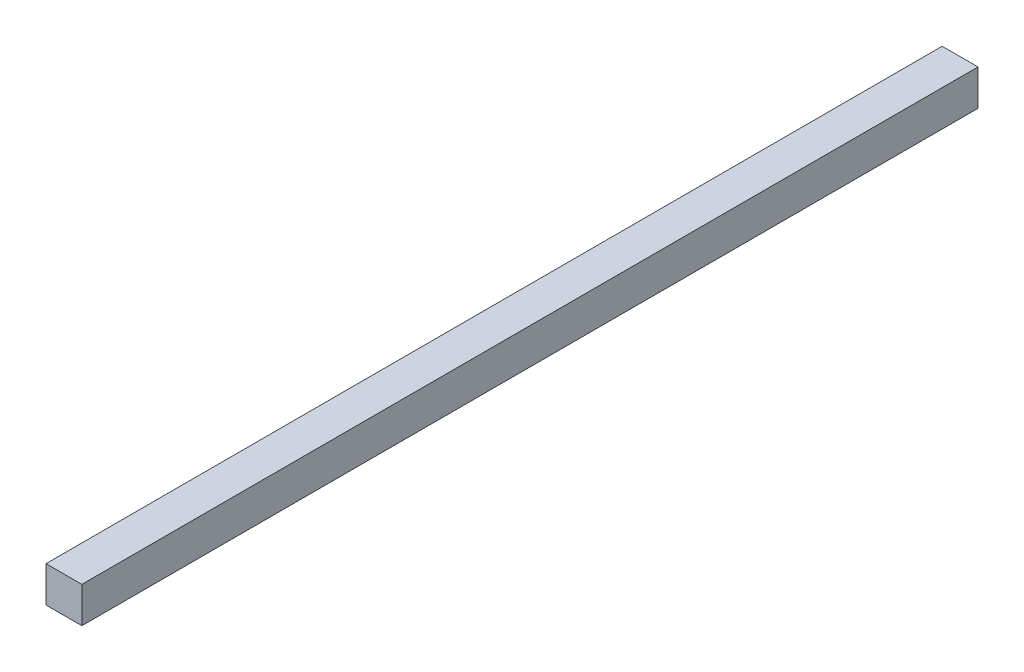
ISO-10303-21;
HEADER;
FILE_DESCRIPTION(('STEP AP214'),'2;1');
FILE_NAME('part.step','',(''),(''),'','','');
FILE_SCHEMA(('AUTOMOTIVE_DESIGN { 1 0 10303 214 1 1 1 1 }'));
ENDSEC;
DATA;
#1=APPLICATION_CONTEXT('core data for automotive mechanical design processes');
#2=APPLICATION_PROTOCOL_DEFINITION('international standard','automotive_design',2000,#1);
#3=PRODUCT_CONTEXT('',#1,'mechanical');
#4=PRODUCT('Part','Part','',(#3));
#5=PRODUCT_RELATED_PRODUCT_CATEGORY('part','',(#4));
#6=PRODUCT_DEFINITION_FORMATION('','',#4);
#7=PRODUCT_DEFINITION_CONTEXT('part definition',#1,'design');
#8=PRODUCT_DEFINITION('design','',#6,#7);
#9=PRODUCT_DEFINITION_SHAPE('','',#8);
#10=(LENGTH_UNIT() NAMED_UNIT(*) SI_UNIT(.MILLI.,.METRE.));
#11=(NAMED_UNIT(*) PLANE_ANGLE_UNIT() SI_UNIT($,.RADIAN.));
#12=(NAMED_UNIT(*) SI_UNIT($,.STERADIAN.) SOLID_ANGLE_UNIT());
#13=UNCERTAINTY_MEASURE_WITH_UNIT(LENGTH_MEASURE(1.E-05),#10,'distance_accuracy_value','');
#14=(GEOMETRIC_REPRESENTATION_CONTEXT(3) GLOBAL_UNCERTAINTY_ASSIGNED_CONTEXT((#13)) GLOBAL_UNIT_ASSIGNED_CONTEXT((#10,
#11,#12)) REPRESENTATION_CONTEXT('',''));
#15=CARTESIAN_POINT('',(0.,0.,0.));
#16=DIRECTION('',(0.,0.,1.));
#17=DIRECTION('',(1.,0.,0.));
#18=AXIS2_PLACEMENT_3D('',#15,#16,#17);
#19=CARTESIAN_POINT('',(-4.,-4.,200.));
#20=DIRECTION('',(1.,0.,0.));
#21=DIRECTION('',(0.,0.,-1.));
#22=AXIS2_PLACEMENT_3D('',#19,#20,#21);
#23=PLANE('',#22);
#24=DIRECTION('',(0.,-1.,0.));
#25=VECTOR('',#24,1.);
#26=CARTESIAN_POINT('',(-4.,-4.,0.));
#27=LINE('',#26,#25);
#28=CARTESIAN_POINT('',(-4.,4.,0.));
#29=VERTEX_POINT('',#28);
#30=CARTESIAN_POINT('',(-4.,-4.,0.));
#31=VERTEX_POINT('',#30);
#32=EDGE_CURVE('E98',#29,#31,#27,.T.);
#33=ORIENTED_EDGE('',*,*,#32,.T.);
#34=DIRECTION('',(0.,0.,-1.));
#35=VECTOR('',#34,1.);
#36=CARTESIAN_POINT('',(-4.,-4.,200.));
#37=LINE('',#36,#35);
#38=CARTESIAN_POINT('',(-4.,-4.,200.));
#39=VERTEX_POINT('',#38);
#40=EDGE_CURVE('E11',#39,#31,#37,.T.);
#41=ORIENTED_EDGE('',*,*,#40,.F.);
#42=DIRECTION('',(0.,-1.,0.));
#43=VECTOR('',#42,1.);
#44=CARTESIAN_POINT('',(-4.,-4.,200.));
#45=LINE('',#44,#43);
#46=CARTESIAN_POINT('',(-4.,4.,200.));
#47=VERTEX_POINT('',#46);
#48=EDGE_CURVE('E86',#47,#39,#45,.T.);
#49=ORIENTED_EDGE('',*,*,#48,.F.);
#50=DIRECTION('',(0.,0.,-1.));
#51=VECTOR('',#50,1.);
#52=CARTESIAN_POINT('',(-4.,4.,200.));
#53=LINE('',#52,#51);
#54=EDGE_CURVE('E94',#47,#29,#53,.T.);
#55=ORIENTED_EDGE('',*,*,#54,.T.);
#56=EDGE_LOOP('',(#33,#41,#49,#55));
#57=FACE_BOUND('',#56,.T.);
#58=ADVANCED_FACE('F35',(#57),#23,.F.);
#59=CARTESIAN_POINT('',(4.,-4.,200.));
#60=DIRECTION('',(0.,1.,0.));
#61=DIRECTION('',(0.,0.,1.));
#62=AXIS2_PLACEMENT_3D('',#59,#60,#61);
#63=PLANE('',#62);
#64=DIRECTION('',(1.,0.,0.));
#65=VECTOR('',#64,1.);
#66=CARTESIAN_POINT('',(4.,-4.,0.));
#67=LINE('',#66,#65);
#68=CARTESIAN_POINT('',(4.,-4.,0.));
#69=VERTEX_POINT('',#68);
#70=EDGE_CURVE('E90',#31,#69,#67,.T.);
#71=ORIENTED_EDGE('',*,*,#70,.T.);
#72=DIRECTION('',(0.,0.,-1.));
#73=VECTOR('',#72,1.);
#74=CARTESIAN_POINT('',(4.,-4.,200.));
#75=LINE('',#74,#73);
#76=CARTESIAN_POINT('',(4.,-4.,200.));
#77=VERTEX_POINT('',#76);
#78=EDGE_CURVE('E43',#77,#69,#75,.T.);
#79=ORIENTED_EDGE('',*,*,#78,.F.);
#80=DIRECTION('',(1.,0.,0.));
#81=VECTOR('',#80,1.);
#82=CARTESIAN_POINT('',(4.,-4.,200.));
#83=LINE('',#82,#81);
#84=EDGE_CURVE('E81',#39,#77,#83,.T.);
#85=ORIENTED_EDGE('',*,*,#84,.F.);
#86=ORIENTED_EDGE('',*,*,#40,.T.);
#87=EDGE_LOOP('',(#71,#79,#85,#86));
#88=FACE_BOUND('',#87,.T.);
#89=ADVANCED_FACE('F89',(#88),#63,.F.);
#90=CARTESIAN_POINT('',(4.,-4.,200.));
#91=DIRECTION('',(-1.,0.,0.));
#92=DIRECTION('',(0.,0.,1.));
#93=AXIS2_PLACEMENT_3D('',#90,#91,#92);
#94=PLANE('',#93);
#95=DIRECTION('',(0.,1.,0.));
#96=VECTOR('',#95,1.);
#97=CARTESIAN_POINT('',(4.,-4.,0.));
#98=LINE('',#97,#96);
#99=CARTESIAN_POINT('',(4.,4.,0.));
#100=VERTEX_POINT('',#99);
#101=EDGE_CURVE('E68',#69,#100,#98,.T.);
#102=ORIENTED_EDGE('',*,*,#101,.T.);
#103=DIRECTION('',(0.,0.,-1.));
#104=VECTOR('',#103,1.);
#105=CARTESIAN_POINT('',(4.,4.,200.));
#106=LINE('',#105,#104);
#107=CARTESIAN_POINT('',(4.,4.,200.));
#108=VERTEX_POINT('',#107);
#109=EDGE_CURVE('E91',#108,#100,#106,.T.);
#110=ORIENTED_EDGE('',*,*,#109,.F.);
#111=DIRECTION('',(0.,1.,0.));
#112=VECTOR('',#111,1.);
#113=CARTESIAN_POINT('',(4.,-4.,200.));
#114=LINE('',#113,#112);
#115=EDGE_CURVE('E84',#77,#108,#114,.T.);
#116=ORIENTED_EDGE('',*,*,#115,.F.);
#117=ORIENTED_EDGE('',*,*,#78,.T.);
#118=EDGE_LOOP('',(#102,#110,#116,#117));
#119=FACE_BOUND('',#118,.T.);
#120=ADVANCED_FACE('F92',(#119),#94,.F.);
#121=CARTESIAN_POINT('',(4.,4.,200.));
#122=DIRECTION('',(0.,-1.,0.));
#123=DIRECTION('',(1.,0.,0.));
#124=AXIS2_PLACEMENT_3D('',#121,#122,#123);
#125=PLANE('',#124);
#126=DIRECTION('',(-1.,0.,0.));
#127=VECTOR('',#126,1.);
#128=CARTESIAN_POINT('',(4.,4.,0.));
#129=LINE('',#128,#127);
#130=EDGE_CURVE('E74',#100,#29,#129,.T.);
#131=ORIENTED_EDGE('',*,*,#130,.T.);
#132=ORIENTED_EDGE('',*,*,#54,.F.);
#133=DIRECTION('',(-1.,0.,0.));
#134=VECTOR('',#133,1.);
#135=CARTESIAN_POINT('',(4.,4.,200.));
#136=LINE('',#135,#134);
#137=EDGE_CURVE('E51',#108,#47,#136,.T.);
#138=ORIENTED_EDGE('',*,*,#137,.F.);
#139=ORIENTED_EDGE('',*,*,#109,.T.);
#140=EDGE_LOOP('',(#131,#132,#138,#139));
#141=FACE_BOUND('',#140,.T.);
#142=ADVANCED_FACE('F105',(#141),#125,.F.);
#143=CARTESIAN_POINT('',(0.,0.,200.));
#144=DIRECTION('',(0.,0.,1.));
#145=DIRECTION('',(1.,0.,0.));
#146=AXIS2_PLACEMENT_3D('',#143,#144,#145);
#147=PLANE('',#146);
#148=ORIENTED_EDGE('',*,*,#48,.T.);
#149=ORIENTED_EDGE('',*,*,#84,.T.);
#150=ORIENTED_EDGE('',*,*,#115,.T.);
#151=ORIENTED_EDGE('',*,*,#137,.T.);
#152=EDGE_LOOP('',(#148,#149,#150,#151));
#153=FACE_BOUND('',#152,.T.);
#154=ADVANCED_FACE('F82',(#153),#147,.T.);
#155=CARTESIAN_POINT('',(0.,0.,0.));
#156=DIRECTION('',(0.,0.,1.));
#157=DIRECTION('',(1.,0.,0.));
#158=AXIS2_PLACEMENT_3D('',#155,#156,#157);
#159=PLANE('',#158);
#160=ORIENTED_EDGE('',*,*,#32,.F.);
#161=ORIENTED_EDGE('',*,*,#130,.F.);
#162=ORIENTED_EDGE('',*,*,#101,.F.);
#163=ORIENTED_EDGE('',*,*,#70,.F.);
#164=EDGE_LOOP('',(#160,#161,#162,#163));
#165=FACE_BOUND('',#164,.T.);
#166=ADVANCED_FACE('F108',(#165),#159,.F.);
#167=CLOSED_SHELL('',(#58,#89,#120,#142,#154,#166));
#168=MANIFOLD_SOLID_BREP('B2',#167);
#169=ADVANCED_BREP_SHAPE_REPRESENTATION('',(#18,#168),#14);
#170=SHAPE_DEFINITION_REPRESENTATION(#9,#169);
ENDSEC;
END-ISO-10303-21;
